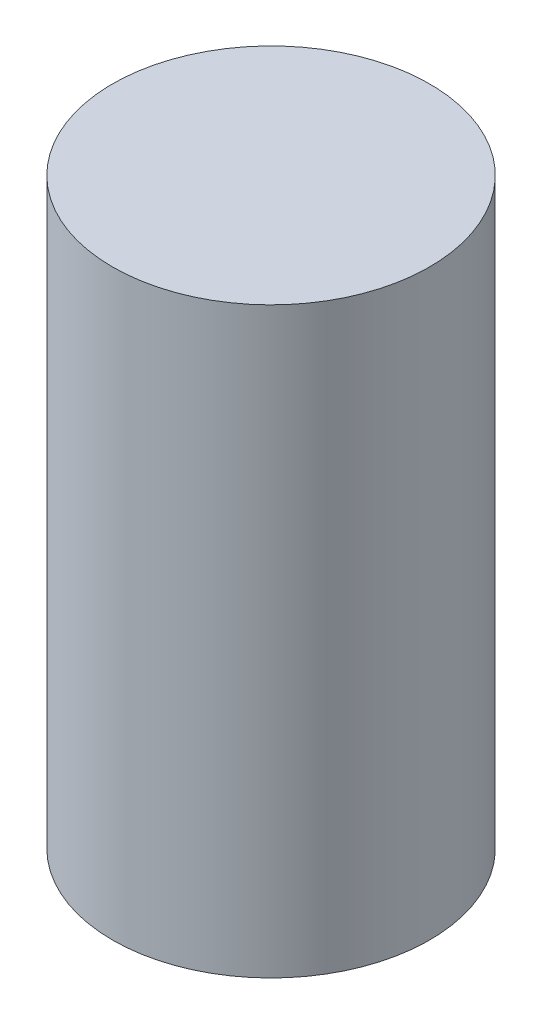
ISO-10303-21;
HEADER;
FILE_DESCRIPTION(('STEP AP214'),'2;1');
FILE_NAME('part.step','',(''),(''),'','','');
FILE_SCHEMA(('AUTOMOTIVE_DESIGN { 1 0 10303 214 1 1 1 1 }'));
ENDSEC;
DATA;
#1=APPLICATION_CONTEXT('core data for automotive mechanical design processes');
#2=APPLICATION_PROTOCOL_DEFINITION('international standard','automotive_design',2000,#1);
#3=PRODUCT_CONTEXT('',#1,'mechanical');
#4=PRODUCT('Part','Part','',(#3));
#5=PRODUCT_RELATED_PRODUCT_CATEGORY('part','',(#4));
#6=PRODUCT_DEFINITION_FORMATION('','',#4);
#7=PRODUCT_DEFINITION_CONTEXT('part definition',#1,'design');
#8=PRODUCT_DEFINITION('design','',#6,#7);
#9=PRODUCT_DEFINITION_SHAPE('','',#8);
#10=(LENGTH_UNIT() NAMED_UNIT(*) SI_UNIT(.MILLI.,.METRE.));
#11=(NAMED_UNIT(*) PLANE_ANGLE_UNIT() SI_UNIT($,.RADIAN.));
#12=(NAMED_UNIT(*) SI_UNIT($,.STERADIAN.) SOLID_ANGLE_UNIT());
#13=UNCERTAINTY_MEASURE_WITH_UNIT(LENGTH_MEASURE(1.E-05),#10,'distance_accuracy_value','');
#14=(GEOMETRIC_REPRESENTATION_CONTEXT(3) GLOBAL_UNCERTAINTY_ASSIGNED_CONTEXT((#13)) GLOBAL_UNIT_ASSIGNED_CONTEXT((#10,
#11,#12)) REPRESENTATION_CONTEXT('',''));
#15=CARTESIAN_POINT('',(0.,0.,0.));
#16=DIRECTION('',(0.,0.,1.));
#17=DIRECTION('',(1.,0.,0.));
#18=AXIS2_PLACEMENT_3D('',#15,#16,#17);
#19=CARTESIAN_POINT('',(0.,250.,0.));
#20=DIRECTION('',(0.,-1.,0.));
#21=DIRECTION('',(0.,0.,-1.));
#22=AXIS2_PLACEMENT_3D('',#19,#20,#21);
#23=CYLINDRICAL_SURFACE('',#22,68.);
#24=CARTESIAN_POINT('',(0.,250.,0.));
#25=DIRECTION('',(0.,1.,0.));
#26=DIRECTION('',(0.,0.,1.));
#27=AXIS2_PLACEMENT_3D('',#24,#25,#26);
#28=CIRCLE('',#27,68.);
#29=CARTESIAN_POINT('',(0.,250.,68.));
#30=VERTEX_POINT('',#29);
#31=EDGE_CURVE('E10',#30,#30,#28,.T.);
#32=ORIENTED_EDGE('',*,*,#31,.F.);
#33=EDGE_LOOP('',(#32));
#34=FACE_BOUND('',#33,.T.);
#35=CARTESIAN_POINT('',(0.,0.,0.));
#36=DIRECTION('',(0.,1.,0.));
#37=DIRECTION('',(0.,0.,1.));
#38=AXIS2_PLACEMENT_3D('',#35,#36,#37);
#39=CIRCLE('',#38,68.);
#40=CARTESIAN_POINT('',(0.,0.,68.));
#41=VERTEX_POINT('',#40);
#42=EDGE_CURVE('E40',#41,#41,#39,.T.);
#43=ORIENTED_EDGE('',*,*,#42,.T.);
#44=EDGE_LOOP('',(#43));
#45=FACE_BOUND('',#44,.T.);
#46=ADVANCED_FACE('F37',(#34,#45),#23,.T.);
#47=CARTESIAN_POINT('',(0.,250.,0.));
#48=DIRECTION('',(0.,1.,0.));
#49=DIRECTION('',(0.,0.,1.));
#50=AXIS2_PLACEMENT_3D('',#47,#48,#49);
#51=PLANE('',#50);
#52=ORIENTED_EDGE('',*,*,#31,.T.);
#53=EDGE_LOOP('',(#52));
#54=FACE_BOUND('',#53,.T.);
#55=ADVANCED_FACE('F54',(#54),#51,.T.);
#56=CARTESIAN_POINT('',(0.,0.,0.));
#57=DIRECTION('',(0.,1.,0.));
#58=DIRECTION('',(0.,0.,1.));
#59=AXIS2_PLACEMENT_3D('',#56,#57,#58);
#60=PLANE('',#59);
#61=ORIENTED_EDGE('',*,*,#42,.F.);
#62=EDGE_LOOP('',(#61));
#63=FACE_BOUND('',#62,.T.);
#64=ADVANCED_FACE('F52',(#63),#60,.F.);
#65=CLOSED_SHELL('',(#46,#55,#64));
#66=MANIFOLD_SOLID_BREP('B2',#65);
#67=ADVANCED_BREP_SHAPE_REPRESENTATION('',(#18,#66),#14);
#68=SHAPE_DEFINITION_REPRESENTATION(#9,#67);
ENDSEC;
END-ISO-10303-21;
